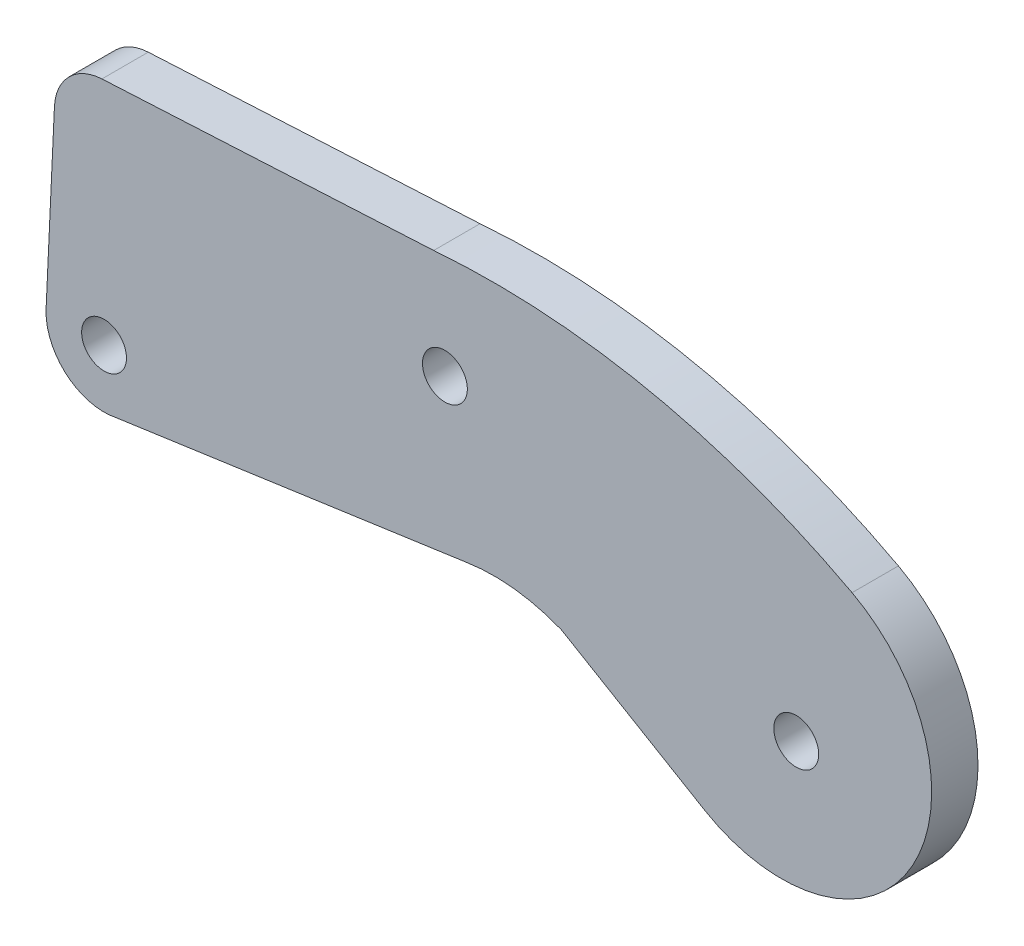
ISO-10303-21;
HEADER;
FILE_DESCRIPTION(('STEP AP214'),'2;1');
FILE_NAME('part.step','',(''),(''),'','','');
FILE_SCHEMA(('AUTOMOTIVE_DESIGN { 1 0 10303 214 1 1 1 1 }'));
ENDSEC;
DATA;
#1=APPLICATION_CONTEXT('core data for automotive mechanical design processes');
#2=APPLICATION_PROTOCOL_DEFINITION('international standard','automotive_design',2000,#1);
#3=PRODUCT_CONTEXT('',#1,'mechanical');
#4=PRODUCT('Part','Part','',(#3));
#5=PRODUCT_RELATED_PRODUCT_CATEGORY('part','',(#4));
#6=PRODUCT_DEFINITION_FORMATION('','',#4);
#7=PRODUCT_DEFINITION_CONTEXT('part definition',#1,'design');
#8=PRODUCT_DEFINITION('design','',#6,#7);
#9=PRODUCT_DEFINITION_SHAPE('','',#8);
#10=(LENGTH_UNIT() NAMED_UNIT(*) SI_UNIT(.MILLI.,.METRE.));
#11=(NAMED_UNIT(*) PLANE_ANGLE_UNIT() SI_UNIT($,.RADIAN.));
#12=(NAMED_UNIT(*) SI_UNIT($,.STERADIAN.) SOLID_ANGLE_UNIT());
#13=UNCERTAINTY_MEASURE_WITH_UNIT(LENGTH_MEASURE(1.E-05),#10,'distance_accuracy_value','');
#14=(GEOMETRIC_REPRESENTATION_CONTEXT(3) GLOBAL_UNCERTAINTY_ASSIGNED_CONTEXT((#13)) GLOBAL_UNIT_ASSIGNED_CONTEXT((#10,
#11,#12)) REPRESENTATION_CONTEXT('',''));
#15=CARTESIAN_POINT('',(0.,0.,0.));
#16=DIRECTION('',(0.,0.,1.));
#17=DIRECTION('',(1.,0.,0.));
#18=AXIS2_PLACEMENT_3D('',#15,#16,#17);
#19=CARTESIAN_POINT('',(-45.6,-19.1999999999999,6.2));
#20=DIRECTION('',(0.,0.,1.));
#21=DIRECTION('',(1.,0.,0.));
#22=AXIS2_PLACEMENT_3D('',#19,#20,#21);
#23=PLANE('',#22);
#24=CARTESIAN_POINT('',(-45.6,-19.1999999999999,6.2));
#25=DIRECTION('',(0.,0.,1.));
#26=DIRECTION('',(1.,0.,0.));
#27=AXIS2_PLACEMENT_3D('',#24,#25,#26);
#28=CIRCLE('',#27,3.);
#29=CARTESIAN_POINT('',(-48.6,-19.1999999999999,6.2));
#30=VERTEX_POINT('',#29);
#31=EDGE_CURVE('E197',#30,#30,#28,.T.);
#32=ORIENTED_EDGE('',*,*,#31,.F.);
#33=EDGE_LOOP('',(#32));
#34=FACE_BOUND('',#33,.T.);
#35=CARTESIAN_POINT('',(-45.6,-19.1999999999999,6.2));
#36=DIRECTION('',(0.,0.,1.));
#37=DIRECTION('',(1.,0.,0.));
#38=AXIS2_PLACEMENT_3D('',#35,#36,#37);
#39=CIRCLE('',#38,7.76659513557916);
#40=CARTESIAN_POINT('',(-53.3663500913287,-19.1383051143039,6.2));
#41=VERTEX_POINT('',#40);
#42=CARTESIAN_POINT('',(-44.,-26.8,6.2));
#43=VERTEX_POINT('',#42);
#44=EDGE_CURVE('E152',#41,#43,#39,.T.);
#45=ORIENTED_EDGE('',*,*,#44,.T.);
#46=DIRECTION('',(0.99001299182397,0.140976154082,0.));
#47=VECTOR('',#46,1.);
#48=CARTESIAN_POINT('',(-44.,-26.8,6.2));
#49=LINE('',#48,#47);
#50=CARTESIAN_POINT('',(2.7,-20.15,6.2));
#51=VERTEX_POINT('',#50);
#52=EDGE_CURVE('E95',#43,#51,#49,.T.);
#53=ORIENTED_EDGE('',*,*,#52,.T.);
#54=CARTESIAN_POINT('',(6.56962183960168,-43.8359879848504,6.2));
#55=DIRECTION('',(0.,0.,-1.));
#56=DIRECTION('',(1.,0.,0.));
#57=AXIS2_PLACEMENT_3D('',#54,#55,#56);
#58=CIRCLE('',#57,24.);
#59=CARTESIAN_POINT('',(15.6,-21.599705240646,6.2));
#60=VERTEX_POINT('',#59);
#61=EDGE_CURVE('E170',#51,#60,#58,.T.);
#62=ORIENTED_EDGE('',*,*,#61,.T.);
#63=DIRECTION('',(0.861052492589684,-0.508516081363305,0.));
#64=VECTOR('',#63,1.);
#65=CARTESIAN_POINT('',(15.6,-21.599705240646,6.2));
#66=LINE('',#65,#64);
#67=CARTESIAN_POINT('',(34.7684358994792,-32.9201043955809,6.2));
#68=VERTEX_POINT('',#67);
#69=EDGE_CURVE('E187',#60,#68,#66,.T.);
#70=ORIENTED_EDGE('',*,*,#69,.T.);
#71=CARTESIAN_POINT('',(45.,-15.5953548060977,6.2));
#72=DIRECTION('',(0.,0.,1.));
#73=DIRECTION('',(1.,0.,0.));
#74=AXIS2_PLACEMENT_3D('',#71,#72,#73);
#75=CIRCLE('',#74,20.1204337001309);
#76=CARTESIAN_POINT('',(54.4696096734835,2.15734484531396,6.2));
#77=VERTEX_POINT('',#76);
#78=EDGE_CURVE('E186',#68,#77,#75,.T.);
#79=ORIENTED_EDGE('',*,*,#78,.T.);
#80=CARTESIAN_POINT('',(6.55406866902199,-87.6700332005859,6.2));
#81=DIRECTION('',(0.,0.,1.));
#82=DIRECTION('',(1.,0.,0.));
#83=AXIS2_PLACEMENT_3D('',#80,#81,#82);
#84=CIRCLE('',#83,101.807941322626);
#85=CARTESIAN_POINT('',(-1.49999999999997,13.8188277360998,6.2));
#86=VERTEX_POINT('',#85);
#87=EDGE_CURVE('E117',#77,#86,#84,.T.);
#88=ORIENTED_EDGE('',*,*,#87,.T.);
#89=DIRECTION('',(-0.998638196370598,-0.0521704202559135,0.));
#90=VECTOR('',#89,1.);
#91=CARTESIAN_POINT('',(-45.8866454729241,11.5000000000001,6.2));
#92=LINE('',#91,#90);
#93=CARTESIAN_POINT('',(-45.8866454729241,11.5000000000001,6.2));
#94=VERTEX_POINT('',#93);
#95=EDGE_CURVE('E111',#86,#94,#92,.T.);
#96=ORIENTED_EDGE('',*,*,#95,.T.);
#97=CARTESIAN_POINT('',(-45.5366270007838,4.80000000000012,6.2));
#98=DIRECTION('',(0.,0.,1.));
#99=DIRECTION('',(1.,0.,0.));
#100=AXIS2_PLACEMENT_3D('',#97,#98,#99);
#101=CIRCLE('',#100,6.7091365264719);
#102=CARTESIAN_POINT('',(-52.238519213366,5.11169488569612,6.2));
#103=VERTEX_POINT('',#102);
#104=EDGE_CURVE('E115',#94,#103,#101,.T.);
#105=ORIENTED_EDGE('',*,*,#104,.T.);
#106=DIRECTION('',(-0.046458271413342,-0.998920231558699,0.));
#107=VECTOR('',#106,1.);
#108=CARTESIAN_POINT('',(-52.238519213366,5.11169488569612,6.2));
#109=LINE('',#108,#107);
#110=EDGE_CURVE('E49',#103,#41,#109,.T.);
#111=ORIENTED_EDGE('',*,*,#110,.T.);
#112=EDGE_LOOP('',(#45,#53,#62,#70,#79,#88,#96,#105,#111));
#113=FACE_BOUND('',#112,.T.);
#114=CARTESIAN_POINT('',(47.,-18.7999999999999,6.2));
#115=DIRECTION('',(0.,0.,1.));
#116=DIRECTION('',(1.,0.,0.));
#117=AXIS2_PLACEMENT_3D('',#114,#115,#116);
#118=CIRCLE('',#117,3.);
#119=CARTESIAN_POINT('',(44.,-18.7999999999999,6.2));
#120=VERTEX_POINT('',#119);
#121=EDGE_CURVE('E139',#120,#120,#118,.T.);
#122=ORIENTED_EDGE('',*,*,#121,.F.);
#123=EDGE_LOOP('',(#122));
#124=FACE_BOUND('',#123,.T.);
#125=CARTESIAN_POINT('',(0.,0.,6.2));
#126=DIRECTION('',(0.,0.,1.));
#127=DIRECTION('',(1.,0.,0.));
#128=AXIS2_PLACEMENT_3D('',#125,#126,#127);
#129=CIRCLE('',#128,3.);
#130=CARTESIAN_POINT('',(-3.,0.,6.2));
#131=VERTEX_POINT('',#130);
#132=EDGE_CURVE('E203',#131,#131,#129,.T.);
#133=ORIENTED_EDGE('',*,*,#132,.F.);
#134=EDGE_LOOP('',(#133));
#135=FACE_BOUND('',#134,.T.);
#136=ADVANCED_FACE('F32',(#34,#113,#124,#135),#23,.T.);
#137=CARTESIAN_POINT('',(-45.6,-19.1999999999999,0.));
#138=DIRECTION('',(0.,0.,1.));
#139=DIRECTION('',(1.,0.,0.));
#140=AXIS2_PLACEMENT_3D('',#137,#138,#139);
#141=PLANE('',#140);
#142=CARTESIAN_POINT('',(-45.6,-19.1999999999999,0.));
#143=DIRECTION('',(0.,0.,1.));
#144=DIRECTION('',(1.,0.,0.));
#145=AXIS2_PLACEMENT_3D('',#142,#143,#144);
#146=CIRCLE('',#145,7.76659513557916);
#147=CARTESIAN_POINT('',(-53.3663500913287,-19.1383051143039,0.));
#148=VERTEX_POINT('',#147);
#149=CARTESIAN_POINT('',(-44.,-26.8,0.));
#150=VERTEX_POINT('',#149);
#151=EDGE_CURVE('E135',#148,#150,#146,.T.);
#152=ORIENTED_EDGE('',*,*,#151,.F.);
#153=DIRECTION('',(-0.046458271413342,-0.998920231558699,0.));
#154=VECTOR('',#153,1.);
#155=CARTESIAN_POINT('',(-52.238519213366,5.11169488569612,0.));
#156=LINE('',#155,#154);
#157=CARTESIAN_POINT('',(-52.238519213366,5.11169488569612,0.));
#158=VERTEX_POINT('',#157);
#159=EDGE_CURVE('E87',#158,#148,#156,.T.);
#160=ORIENTED_EDGE('',*,*,#159,.F.);
#161=CARTESIAN_POINT('',(-45.5366270007838,4.80000000000012,0.));
#162=DIRECTION('',(0.,0.,1.));
#163=DIRECTION('',(1.,0.,0.));
#164=AXIS2_PLACEMENT_3D('',#161,#162,#163);
#165=CIRCLE('',#164,6.7091365264719);
#166=CARTESIAN_POINT('',(-45.8866454729241,11.5000000000001,0.));
#167=VERTEX_POINT('',#166);
#168=EDGE_CURVE('E81',#167,#158,#165,.T.);
#169=ORIENTED_EDGE('',*,*,#168,.F.);
#170=DIRECTION('',(-0.998638196370598,-0.0521704202559135,0.));
#171=VECTOR('',#170,1.);
#172=CARTESIAN_POINT('',(-45.8866454729241,11.5000000000001,0.));
#173=LINE('',#172,#171);
#174=CARTESIAN_POINT('',(-1.49999999999997,13.8188277360998,0.));
#175=VERTEX_POINT('',#174);
#176=EDGE_CURVE('E125',#175,#167,#173,.T.);
#177=ORIENTED_EDGE('',*,*,#176,.F.);
#178=CARTESIAN_POINT('',(6.55406866902199,-87.6700332005859,0.));
#179=DIRECTION('',(0.,0.,1.));
#180=DIRECTION('',(1.,0.,0.));
#181=AXIS2_PLACEMENT_3D('',#178,#179,#180);
#182=CIRCLE('',#181,101.807941322626);
#183=CARTESIAN_POINT('',(54.4696096734835,2.15734484531396,0.));
#184=VERTEX_POINT('',#183);
#185=EDGE_CURVE('E147',#184,#175,#182,.T.);
#186=ORIENTED_EDGE('',*,*,#185,.F.);
#187=CARTESIAN_POINT('',(45.,-15.5953548060977,0.));
#188=DIRECTION('',(0.,0.,1.));
#189=DIRECTION('',(1.,0.,0.));
#190=AXIS2_PLACEMENT_3D('',#187,#188,#189);
#191=CIRCLE('',#190,20.1204337001309);
#192=CARTESIAN_POINT('',(34.7684358994792,-32.9201043955809,0.));
#193=VERTEX_POINT('',#192);
#194=EDGE_CURVE('E145',#193,#184,#191,.T.);
#195=ORIENTED_EDGE('',*,*,#194,.F.);
#196=DIRECTION('',(0.861052492589684,-0.508516081363305,0.));
#197=VECTOR('',#196,1.);
#198=CARTESIAN_POINT('',(15.6,-21.599705240646,0.));
#199=LINE('',#198,#197);
#200=CARTESIAN_POINT('',(15.6,-21.599705240646,0.));
#201=VERTEX_POINT('',#200);
#202=EDGE_CURVE('E143',#201,#193,#199,.T.);
#203=ORIENTED_EDGE('',*,*,#202,.F.);
#204=CARTESIAN_POINT('',(6.56962183960168,-43.8359879848504,0.));
#205=DIRECTION('',(0.,0.,-1.));
#206=DIRECTION('',(1.,0.,0.));
#207=AXIS2_PLACEMENT_3D('',#204,#205,#206);
#208=CIRCLE('',#207,24.);
#209=CARTESIAN_POINT('',(2.7,-20.15,0.));
#210=VERTEX_POINT('',#209);
#211=EDGE_CURVE('E141',#210,#201,#208,.T.);
#212=ORIENTED_EDGE('',*,*,#211,.F.);
#213=DIRECTION('',(0.99001299182397,0.140976154082,0.));
#214=VECTOR('',#213,1.);
#215=CARTESIAN_POINT('',(-44.,-26.8,0.));
#216=LINE('',#215,#214);
#217=EDGE_CURVE('E138',#150,#210,#216,.T.);
#218=ORIENTED_EDGE('',*,*,#217,.F.);
#219=EDGE_LOOP('',(#152,#160,#169,#177,#186,#195,#203,#212,#218));
#220=FACE_BOUND('',#219,.T.);
#221=CARTESIAN_POINT('',(47.,-18.7999999999999,0.));
#222=DIRECTION('',(0.,0.,1.));
#223=DIRECTION('',(1.,0.,0.));
#224=AXIS2_PLACEMENT_3D('',#221,#222,#223);
#225=CIRCLE('',#224,3.);
#226=CARTESIAN_POINT('',(44.,-18.7999999999999,0.));
#227=VERTEX_POINT('',#226);
#228=EDGE_CURVE('E194',#227,#227,#225,.T.);
#229=ORIENTED_EDGE('',*,*,#228,.T.);
#230=EDGE_LOOP('',(#229));
#231=FACE_BOUND('',#230,.T.);
#232=CARTESIAN_POINT('',(-45.6,-19.1999999999999,0.));
#233=DIRECTION('',(0.,0.,1.));
#234=DIRECTION('',(1.,0.,0.));
#235=AXIS2_PLACEMENT_3D('',#232,#233,#234);
#236=CIRCLE('',#235,3.);
#237=CARTESIAN_POINT('',(-48.6,-19.1999999999999,0.));
#238=VERTEX_POINT('',#237);
#239=EDGE_CURVE('E200',#238,#238,#236,.T.);
#240=ORIENTED_EDGE('',*,*,#239,.T.);
#241=EDGE_LOOP('',(#240));
#242=FACE_BOUND('',#241,.T.);
#243=CARTESIAN_POINT('',(0.,0.,0.));
#244=DIRECTION('',(0.,0.,1.));
#245=DIRECTION('',(1.,0.,0.));
#246=AXIS2_PLACEMENT_3D('',#243,#244,#245);
#247=CIRCLE('',#246,3.);
#248=CARTESIAN_POINT('',(-3.,0.,0.));
#249=VERTEX_POINT('',#248);
#250=EDGE_CURVE('E206',#249,#249,#247,.T.);
#251=ORIENTED_EDGE('',*,*,#250,.T.);
#252=EDGE_LOOP('',(#251));
#253=FACE_BOUND('',#252,.T.);
#254=ADVANCED_FACE('F174',(#220,#231,#242,#253),#141,.F.);
#255=CARTESIAN_POINT('',(-45.6,-19.1999999999999,6.2));
#256=DIRECTION('',(0.,0.,-1.));
#257=DIRECTION('',(-1.,0.,0.));
#258=AXIS2_PLACEMENT_3D('',#255,#256,#257);
#259=CYLINDRICAL_SURFACE('',#258,7.76659513557916);
#260=ORIENTED_EDGE('',*,*,#151,.T.);
#261=DIRECTION('',(0.,0.,-1.));
#262=VECTOR('',#261,1.);
#263=CARTESIAN_POINT('',(-44.,-26.8,6.2));
#264=LINE('',#263,#262);
#265=EDGE_CURVE('E11',#43,#150,#264,.T.);
#266=ORIENTED_EDGE('',*,*,#265,.F.);
#267=ORIENTED_EDGE('',*,*,#44,.F.);
#268=DIRECTION('',(0.,0.,-1.));
#269=VECTOR('',#268,1.);
#270=CARTESIAN_POINT('',(-53.3663500913287,-19.1383051143039,6.2));
#271=LINE('',#270,#269);
#272=EDGE_CURVE('E131',#41,#148,#271,.T.);
#273=ORIENTED_EDGE('',*,*,#272,.T.);
#274=EDGE_LOOP('',(#260,#266,#267,#273));
#275=FACE_BOUND('',#274,.T.);
#276=ADVANCED_FACE('F34',(#275),#259,.T.);
#277=CARTESIAN_POINT('',(-44.,-26.8,6.2));
#278=DIRECTION('',(-0.140976154082,0.99001299182397,0.));
#279=DIRECTION('',(-0.99001299182397,-0.140976154082,0.));
#280=AXIS2_PLACEMENT_3D('',#277,#278,#279);
#281=PLANE('',#280);
#282=ORIENTED_EDGE('',*,*,#217,.T.);
#283=DIRECTION('',(0.,0.,-1.));
#284=VECTOR('',#283,1.);
#285=CARTESIAN_POINT('',(2.7,-20.15,6.2));
#286=LINE('',#285,#284);
#287=EDGE_CURVE('E41',#51,#210,#286,.T.);
#288=ORIENTED_EDGE('',*,*,#287,.F.);
#289=ORIENTED_EDGE('',*,*,#52,.F.);
#290=ORIENTED_EDGE('',*,*,#265,.T.);
#291=EDGE_LOOP('',(#282,#288,#289,#290));
#292=FACE_BOUND('',#291,.T.);
#293=ADVANCED_FACE('F243',(#292),#281,.F.);
#294=CARTESIAN_POINT('',(6.56962183960168,-43.8359879848504,6.2));
#295=DIRECTION('',(0.,0.,-1.));
#296=DIRECTION('',(-1.,0.,0.));
#297=AXIS2_PLACEMENT_3D('',#294,#295,#296);
#298=CYLINDRICAL_SURFACE('',#297,24.);
#299=ORIENTED_EDGE('',*,*,#211,.T.);
#300=DIRECTION('',(0.,0.,-1.));
#301=VECTOR('',#300,1.);
#302=CARTESIAN_POINT('',(15.6,-21.599705240646,6.2));
#303=LINE('',#302,#301);
#304=EDGE_CURVE('E162',#60,#201,#303,.T.);
#305=ORIENTED_EDGE('',*,*,#304,.F.);
#306=ORIENTED_EDGE('',*,*,#61,.F.);
#307=ORIENTED_EDGE('',*,*,#287,.T.);
#308=EDGE_LOOP('',(#299,#305,#306,#307));
#309=FACE_BOUND('',#308,.T.);
#310=ADVANCED_FACE('F168',(#309),#298,.F.);
#311=CARTESIAN_POINT('',(15.6,-21.599705240646,6.2));
#312=DIRECTION('',(0.508516081363305,0.861052492589684,0.));
#313=DIRECTION('',(-0.861052492589684,0.508516081363305,0.));
#314=AXIS2_PLACEMENT_3D('',#311,#312,#313);
#315=PLANE('',#314);
#316=ORIENTED_EDGE('',*,*,#202,.T.);
#317=DIRECTION('',(0.,0.,-1.));
#318=VECTOR('',#317,1.);
#319=CARTESIAN_POINT('',(34.7684358994792,-32.9201043955809,6.2));
#320=LINE('',#319,#318);
#321=EDGE_CURVE('E159',#68,#193,#320,.T.);
#322=ORIENTED_EDGE('',*,*,#321,.F.);
#323=ORIENTED_EDGE('',*,*,#69,.F.);
#324=ORIENTED_EDGE('',*,*,#304,.T.);
#325=EDGE_LOOP('',(#316,#322,#323,#324));
#326=FACE_BOUND('',#325,.T.);
#327=ADVANCED_FACE('F180',(#326),#315,.F.);
#328=CARTESIAN_POINT('',(45.,-15.5953548060977,6.2));
#329=DIRECTION('',(0.,0.,-1.));
#330=DIRECTION('',(-1.,0.,0.));
#331=AXIS2_PLACEMENT_3D('',#328,#329,#330);
#332=CYLINDRICAL_SURFACE('',#331,20.1204337001309);
#333=ORIENTED_EDGE('',*,*,#194,.T.);
#334=DIRECTION('',(0.,0.,-1.));
#335=VECTOR('',#334,1.);
#336=CARTESIAN_POINT('',(54.4696096734835,2.15734484531396,6.2));
#337=LINE('',#336,#335);
#338=EDGE_CURVE('E156',#77,#184,#337,.T.);
#339=ORIENTED_EDGE('',*,*,#338,.F.);
#340=ORIENTED_EDGE('',*,*,#78,.F.);
#341=ORIENTED_EDGE('',*,*,#321,.T.);
#342=EDGE_LOOP('',(#333,#339,#340,#341));
#343=FACE_BOUND('',#342,.T.);
#344=ADVANCED_FACE('F184',(#343),#332,.T.);
#345=CARTESIAN_POINT('',(6.55406866902199,-87.6700332005859,6.2));
#346=DIRECTION('',(0.,0.,-1.));
#347=DIRECTION('',(-1.,0.,0.));
#348=AXIS2_PLACEMENT_3D('',#345,#346,#347);
#349=CYLINDRICAL_SURFACE('',#348,101.807941322626);
#350=ORIENTED_EDGE('',*,*,#185,.T.);
#351=DIRECTION('',(0.,0.,-1.));
#352=VECTOR('',#351,1.);
#353=CARTESIAN_POINT('',(-1.49999999999997,13.8188277360998,6.2));
#354=LINE('',#353,#352);
#355=EDGE_CURVE('E126',#86,#175,#354,.T.);
#356=ORIENTED_EDGE('',*,*,#355,.F.);
#357=ORIENTED_EDGE('',*,*,#87,.F.);
#358=ORIENTED_EDGE('',*,*,#338,.T.);
#359=EDGE_LOOP('',(#350,#356,#357,#358));
#360=FACE_BOUND('',#359,.T.);
#361=ADVANCED_FACE('F234',(#360),#349,.T.);
#362=CARTESIAN_POINT('',(-45.8866454729241,11.5000000000001,6.2));
#363=DIRECTION('',(0.0521704202559135,-0.998638196370598,0.));
#364=DIRECTION('',(0.998638196370598,0.0521704202559135,0.));
#365=AXIS2_PLACEMENT_3D('',#362,#363,#364);
#366=PLANE('',#365);
#367=ORIENTED_EDGE('',*,*,#176,.T.);
#368=DIRECTION('',(0.,0.,-1.));
#369=VECTOR('',#368,1.);
#370=CARTESIAN_POINT('',(-45.8866454729241,11.5000000000001,6.2));
#371=LINE('',#370,#369);
#372=EDGE_CURVE('E122',#94,#167,#371,.T.);
#373=ORIENTED_EDGE('',*,*,#372,.F.);
#374=ORIENTED_EDGE('',*,*,#95,.F.);
#375=ORIENTED_EDGE('',*,*,#355,.T.);
#376=EDGE_LOOP('',(#367,#373,#374,#375));
#377=FACE_BOUND('',#376,.T.);
#378=ADVANCED_FACE('F123',(#377),#366,.F.);
#379=CARTESIAN_POINT('',(-45.5366270007838,4.80000000000012,6.2));
#380=DIRECTION('',(0.,0.,-1.));
#381=DIRECTION('',(-1.,0.,0.));
#382=AXIS2_PLACEMENT_3D('',#379,#380,#381);
#383=CYLINDRICAL_SURFACE('',#382,6.7091365264719);
#384=ORIENTED_EDGE('',*,*,#168,.T.);
#385=DIRECTION('',(0.,0.,-1.));
#386=VECTOR('',#385,1.);
#387=CARTESIAN_POINT('',(-52.238519213366,5.11169488569612,6.2));
#388=LINE('',#387,#386);
#389=EDGE_CURVE('E127',#103,#158,#388,.T.);
#390=ORIENTED_EDGE('',*,*,#389,.F.);
#391=ORIENTED_EDGE('',*,*,#104,.F.);
#392=ORIENTED_EDGE('',*,*,#372,.T.);
#393=EDGE_LOOP('',(#384,#390,#391,#392));
#394=FACE_BOUND('',#393,.T.);
#395=ADVANCED_FACE('F129',(#394),#383,.T.);
#396=CARTESIAN_POINT('',(-52.238519213366,5.11169488569612,6.2));
#397=DIRECTION('',(0.998920231558699,-0.046458271413342,0.));
#398=DIRECTION('',(0.046458271413342,0.998920231558699,0.));
#399=AXIS2_PLACEMENT_3D('',#396,#397,#398);
#400=PLANE('',#399);
#401=ORIENTED_EDGE('',*,*,#159,.T.);
#402=ORIENTED_EDGE('',*,*,#272,.F.);
#403=ORIENTED_EDGE('',*,*,#110,.F.);
#404=ORIENTED_EDGE('',*,*,#389,.T.);
#405=EDGE_LOOP('',(#401,#402,#403,#404));
#406=FACE_BOUND('',#405,.T.);
#407=ADVANCED_FACE('F227',(#406),#400,.F.);
#408=CARTESIAN_POINT('',(47.,-18.7999999999999,6.2));
#409=DIRECTION('',(0.,0.,-1.));
#410=DIRECTION('',(-1.,0.,0.));
#411=AXIS2_PLACEMENT_3D('',#408,#409,#410);
#412=CYLINDRICAL_SURFACE('',#411,3.);
#413=CARTESIAN_POINT('',(44.,-18.7999999999999,6.2));
#414=CARTESIAN_POINT('',(44.,-18.7999999999999,6.13541666666667));
#415=CARTESIAN_POINT('',(44.,-18.7999999999999,6.07083333333333));
#416=CARTESIAN_POINT('',(44.,-18.7999999999999,5.94166666666667));
#417=CARTESIAN_POINT('',(44.,-18.7999999999999,5.87708333333333));
#418=CARTESIAN_POINT('',(44.,-18.7999999999999,5.74791666666667));
#419=CARTESIAN_POINT('',(44.,-18.7999999999999,5.68333333333333));
#420=CARTESIAN_POINT('',(44.,-18.7999999999999,5.55416666666667));
#421=CARTESIAN_POINT('',(44.,-18.7999999999999,5.48958333333333));
#422=CARTESIAN_POINT('',(44.,-18.7999999999999,5.36041666666667));
#423=CARTESIAN_POINT('',(44.,-18.7999999999999,5.29583333333333));
#424=CARTESIAN_POINT('',(44.,-18.7999999999999,5.16666666666667));
#425=CARTESIAN_POINT('',(44.,-18.7999999999999,5.10208333333333));
#426=CARTESIAN_POINT('',(44.,-18.7999999999999,4.97291666666667));
#427=CARTESIAN_POINT('',(44.,-18.7999999999999,4.90833333333333));
#428=CARTESIAN_POINT('',(44.,-18.7999999999999,4.77916666666667));
#429=CARTESIAN_POINT('',(44.,-18.7999999999999,4.71458333333333));
#430=CARTESIAN_POINT('',(44.,-18.7999999999999,4.58541666666667));
#431=CARTESIAN_POINT('',(44.,-18.7999999999999,4.52083333333333));
#432=CARTESIAN_POINT('',(44.,-18.7999999999999,4.39166666666667));
#433=CARTESIAN_POINT('',(44.,-18.7999999999999,4.32708333333333));
#434=CARTESIAN_POINT('',(44.,-18.7999999999999,4.19791666666667));
#435=CARTESIAN_POINT('',(44.,-18.7999999999999,4.13333333333333));
#436=CARTESIAN_POINT('',(44.,-18.7999999999999,4.00416666666667));
#437=CARTESIAN_POINT('',(44.,-18.7999999999999,3.93958333333333));
#438=CARTESIAN_POINT('',(44.,-18.7999999999999,3.81041666666667));
#439=CARTESIAN_POINT('',(44.,-18.7999999999999,3.74583333333333));
#440=CARTESIAN_POINT('',(44.,-18.7999999999999,3.61666666666667));
#441=CARTESIAN_POINT('',(44.,-18.7999999999999,3.55208333333333));
#442=CARTESIAN_POINT('',(44.,-18.7999999999999,3.42291666666667));
#443=CARTESIAN_POINT('',(44.,-18.7999999999999,3.35833333333333));
#444=CARTESIAN_POINT('',(44.,-18.7999999999999,3.22916666666667));
#445=CARTESIAN_POINT('',(44.,-18.7999999999999,3.16458333333333));
#446=CARTESIAN_POINT('',(44.,-18.7999999999999,3.03541666666667));
#447=CARTESIAN_POINT('',(44.,-18.7999999999999,2.97083333333333));
#448=CARTESIAN_POINT('',(44.,-18.7999999999999,2.84166666666667));
#449=CARTESIAN_POINT('',(44.,-18.7999999999999,2.77708333333333));
#450=CARTESIAN_POINT('',(44.,-18.7999999999999,2.64791666666667));
#451=CARTESIAN_POINT('',(44.,-18.7999999999999,2.58333333333333));
#452=CARTESIAN_POINT('',(44.,-18.7999999999999,2.45416666666667));
#453=CARTESIAN_POINT('',(44.,-18.7999999999999,2.38958333333333));
#454=CARTESIAN_POINT('',(44.,-18.7999999999999,2.26041666666667));
#455=CARTESIAN_POINT('',(44.,-18.7999999999999,2.19583333333333));
#456=CARTESIAN_POINT('',(44.,-18.7999999999999,2.06666666666667));
#457=CARTESIAN_POINT('',(44.,-18.7999999999999,2.00208333333333));
#458=CARTESIAN_POINT('',(44.,-18.7999999999999,1.87291666666667));
#459=CARTESIAN_POINT('',(44.,-18.7999999999999,1.80833333333333));
#460=CARTESIAN_POINT('',(44.,-18.7999999999999,1.67916666666667));
#461=CARTESIAN_POINT('',(44.,-18.7999999999999,1.61458333333333));
#462=CARTESIAN_POINT('',(44.,-18.7999999999999,1.48541666666667));
#463=CARTESIAN_POINT('',(44.,-18.7999999999999,1.42083333333333));
#464=CARTESIAN_POINT('',(44.,-18.7999999999999,1.29166666666667));
#465=CARTESIAN_POINT('',(44.,-18.7999999999999,1.22708333333333));
#466=CARTESIAN_POINT('',(44.,-18.7999999999999,1.09791666666667));
#467=CARTESIAN_POINT('',(44.,-18.7999999999999,1.03333333333333));
#468=CARTESIAN_POINT('',(44.,-18.7999999999999,0.904166666666667));
#469=CARTESIAN_POINT('',(44.,-18.7999999999999,0.839583333333333));
#470=CARTESIAN_POINT('',(44.,-18.7999999999999,0.710416666666666));
#471=CARTESIAN_POINT('',(44.,-18.7999999999999,0.645833333333333));
#472=CARTESIAN_POINT('',(44.,-18.7999999999999,0.516666666666667));
#473=CARTESIAN_POINT('',(44.,-18.7999999999999,0.452083333333333));
#474=CARTESIAN_POINT('',(44.,-18.7999999999999,0.322916666666667));
#475=CARTESIAN_POINT('',(44.,-18.7999999999999,0.258333333333334));
#476=CARTESIAN_POINT('',(44.,-18.7999999999999,0.129166666666667));
#477=CARTESIAN_POINT('',(44.,-18.7999999999999,0.0645833333333335));
#478=CARTESIAN_POINT('',(44.,-18.7999999999999,0.));
#479=B_SPLINE_CURVE_WITH_KNOTS('',3,(#413,#414,#415,#416,#417,#418,#419,#420,#421,#422,#423,
#424,#425,#426,#427,#428,#429,#430,#431,#432,#433,#434,#435,#436,#437,#438,#439,#440,#441,#442,
#443,#444,#445,#446,#447,#448,#449,#450,#451,#452,#453,#454,#455,#456,#457,#458,#459,#460,#461,
#462,#463,#464,#465,#466,#467,#468,#469,#470,#471,#472,#473,#474,#475,#476,#477,#478),
.UNSPECIFIED.,.F.,.F.,(4,2,2,2,2,2,2,2,2,2,2,2,2,2,2,2,2,2,2,2,2,2,2,2,2,2,2,2,2,2,2,2,4),(0.,
0.193749999999999,0.3875,0.581249999999999,0.775,0.968749999999999,1.1625,1.35625,1.55,1.74375,
1.9375,2.13125,2.325,2.51875,2.7125,2.90625,3.1,3.29375,3.4875,3.68125,3.875,4.06875,4.2625,
4.45625,4.65,4.84375,5.0375,5.23125,5.425,5.61875,5.8125,6.00625,6.2),.UNSPECIFIED.);
#480=EDGE_CURVE('BSEAM224',#120,#227,#479,.T.);
#481=ORIENTED_EDGE('',*,*,#121,.T.);
#482=ORIENTED_EDGE('',*,*,#228,.F.);
#483=ORIENTED_EDGE('',*,*,#480,.T.);
#484=ORIENTED_EDGE('',*,*,#480,.F.);
#485=EDGE_LOOP('',(#481,#483,#482,#484));
#486=FACE_BOUND('',#485,.T.);
#487=ADVANCED_FACE('F224',(#486),#412,.F.);
#488=CARTESIAN_POINT('',(-45.6,-19.1999999999999,6.2));
#489=DIRECTION('',(0.,0.,-1.));
#490=DIRECTION('',(-1.,0.,0.));
#491=AXIS2_PLACEMENT_3D('',#488,#489,#490);
#492=CYLINDRICAL_SURFACE('',#491,3.);
#493=CARTESIAN_POINT('',(-48.6,-19.1999999999999,6.2));
#494=CARTESIAN_POINT('',(-48.6,-19.1999999999999,6.13541666666667));
#495=CARTESIAN_POINT('',(-48.6,-19.1999999999999,6.07083333333333));
#496=CARTESIAN_POINT('',(-48.6,-19.1999999999999,5.94166666666667));
#497=CARTESIAN_POINT('',(-48.6,-19.1999999999999,5.87708333333333));
#498=CARTESIAN_POINT('',(-48.6,-19.1999999999999,5.74791666666667));
#499=CARTESIAN_POINT('',(-48.6,-19.1999999999999,5.68333333333333));
#500=CARTESIAN_POINT('',(-48.6,-19.1999999999999,5.55416666666667));
#501=CARTESIAN_POINT('',(-48.6,-19.1999999999999,5.48958333333333));
#502=CARTESIAN_POINT('',(-48.6,-19.1999999999999,5.36041666666667));
#503=CARTESIAN_POINT('',(-48.6,-19.1999999999999,5.29583333333333));
#504=CARTESIAN_POINT('',(-48.6,-19.1999999999999,5.16666666666667));
#505=CARTESIAN_POINT('',(-48.6,-19.1999999999999,5.10208333333333));
#506=CARTESIAN_POINT('',(-48.6,-19.1999999999999,4.97291666666667));
#507=CARTESIAN_POINT('',(-48.6,-19.1999999999999,4.90833333333333));
#508=CARTESIAN_POINT('',(-48.6,-19.1999999999999,4.77916666666667));
#509=CARTESIAN_POINT('',(-48.6,-19.1999999999999,4.71458333333333));
#510=CARTESIAN_POINT('',(-48.6,-19.1999999999999,4.58541666666667));
#511=CARTESIAN_POINT('',(-48.6,-19.1999999999999,4.52083333333333));
#512=CARTESIAN_POINT('',(-48.6,-19.1999999999999,4.39166666666667));
#513=CARTESIAN_POINT('',(-48.6,-19.1999999999999,4.32708333333333));
#514=CARTESIAN_POINT('',(-48.6,-19.1999999999999,4.19791666666667));
#515=CARTESIAN_POINT('',(-48.6,-19.1999999999999,4.13333333333333));
#516=CARTESIAN_POINT('',(-48.6,-19.1999999999999,4.00416666666667));
#517=CARTESIAN_POINT('',(-48.6,-19.1999999999999,3.93958333333333));
#518=CARTESIAN_POINT('',(-48.6,-19.1999999999999,3.81041666666667));
#519=CARTESIAN_POINT('',(-48.6,-19.1999999999999,3.74583333333333));
#520=CARTESIAN_POINT('',(-48.6,-19.1999999999999,3.61666666666667));
#521=CARTESIAN_POINT('',(-48.6,-19.1999999999999,3.55208333333333));
#522=CARTESIAN_POINT('',(-48.6,-19.1999999999999,3.42291666666667));
#523=CARTESIAN_POINT('',(-48.6,-19.1999999999999,3.35833333333333));
#524=CARTESIAN_POINT('',(-48.6,-19.1999999999999,3.22916666666667));
#525=CARTESIAN_POINT('',(-48.6,-19.1999999999999,3.16458333333333));
#526=CARTESIAN_POINT('',(-48.6,-19.1999999999999,3.03541666666667));
#527=CARTESIAN_POINT('',(-48.6,-19.1999999999999,2.97083333333333));
#528=CARTESIAN_POINT('',(-48.6,-19.1999999999999,2.84166666666667));
#529=CARTESIAN_POINT('',(-48.6,-19.1999999999999,2.77708333333333));
#530=CARTESIAN_POINT('',(-48.6,-19.1999999999999,2.64791666666667));
#531=CARTESIAN_POINT('',(-48.6,-19.1999999999999,2.58333333333333));
#532=CARTESIAN_POINT('',(-48.6,-19.1999999999999,2.45416666666667));
#533=CARTESIAN_POINT('',(-48.6,-19.1999999999999,2.38958333333333));
#534=CARTESIAN_POINT('',(-48.6,-19.1999999999999,2.26041666666667));
#535=CARTESIAN_POINT('',(-48.6,-19.1999999999999,2.19583333333333));
#536=CARTESIAN_POINT('',(-48.6,-19.1999999999999,2.06666666666667));
#537=CARTESIAN_POINT('',(-48.6,-19.1999999999999,2.00208333333333));
#538=CARTESIAN_POINT('',(-48.6,-19.1999999999999,1.87291666666667));
#539=CARTESIAN_POINT('',(-48.6,-19.1999999999999,1.80833333333333));
#540=CARTESIAN_POINT('',(-48.6,-19.1999999999999,1.67916666666667));
#541=CARTESIAN_POINT('',(-48.6,-19.1999999999999,1.61458333333333));
#542=CARTESIAN_POINT('',(-48.6,-19.1999999999999,1.48541666666667));
#543=CARTESIAN_POINT('',(-48.6,-19.1999999999999,1.42083333333333));
#544=CARTESIAN_POINT('',(-48.6,-19.1999999999999,1.29166666666667));
#545=CARTESIAN_POINT('',(-48.6,-19.1999999999999,1.22708333333333));
#546=CARTESIAN_POINT('',(-48.6,-19.1999999999999,1.09791666666667));
#547=CARTESIAN_POINT('',(-48.6,-19.1999999999999,1.03333333333333));
#548=CARTESIAN_POINT('',(-48.6,-19.1999999999999,0.904166666666667));
#549=CARTESIAN_POINT('',(-48.6,-19.1999999999999,0.839583333333333));
#550=CARTESIAN_POINT('',(-48.6,-19.1999999999999,0.710416666666666));
#551=CARTESIAN_POINT('',(-48.6,-19.1999999999999,0.645833333333333));
#552=CARTESIAN_POINT('',(-48.6,-19.1999999999999,0.516666666666667));
#553=CARTESIAN_POINT('',(-48.6,-19.1999999999999,0.452083333333333));
#554=CARTESIAN_POINT('',(-48.6,-19.1999999999999,0.322916666666667));
#555=CARTESIAN_POINT('',(-48.6,-19.1999999999999,0.258333333333334));
#556=CARTESIAN_POINT('',(-48.6,-19.1999999999999,0.129166666666667));
#557=CARTESIAN_POINT('',(-48.6,-19.1999999999999,0.0645833333333335));
#558=CARTESIAN_POINT('',(-48.6,-19.1999999999999,0.));
#559=B_SPLINE_CURVE_WITH_KNOTS('',3,(#493,#494,#495,#496,#497,#498,#499,#500,#501,#502,#503,
#504,#505,#506,#507,#508,#509,#510,#511,#512,#513,#514,#515,#516,#517,#518,#519,#520,#521,#522,
#523,#524,#525,#526,#527,#528,#529,#530,#531,#532,#533,#534,#535,#536,#537,#538,#539,#540,#541,
#542,#543,#544,#545,#546,#547,#548,#549,#550,#551,#552,#553,#554,#555,#556,#557,#558),
.UNSPECIFIED.,.F.,.F.,(4,2,2,2,2,2,2,2,2,2,2,2,2,2,2,2,2,2,2,2,2,2,2,2,2,2,2,2,2,2,2,2,4),(0.,
0.193749999999999,0.3875,0.581249999999999,0.775,0.968749999999999,1.1625,1.35625,1.55,1.74375,
1.9375,2.13125,2.325,2.51875,2.7125,2.90625,3.1,3.29375,3.4875,3.68125,3.875,4.06875,4.2625,
4.45625,4.65,4.84375,5.0375,5.23125,5.425,5.61875,5.8125,6.00625,6.2),.UNSPECIFIED.);
#560=EDGE_CURVE('BSEAM312',#30,#238,#559,.T.);
#561=ORIENTED_EDGE('',*,*,#31,.T.);
#562=ORIENTED_EDGE('',*,*,#239,.F.);
#563=ORIENTED_EDGE('',*,*,#560,.T.);
#564=ORIENTED_EDGE('',*,*,#560,.F.);
#565=EDGE_LOOP('',(#561,#563,#562,#564));
#566=FACE_BOUND('',#565,.T.);
#567=ADVANCED_FACE('F312',(#566),#492,.F.);
#568=CARTESIAN_POINT('',(0.,0.,6.2));
#569=DIRECTION('',(0.,0.,-1.));
#570=DIRECTION('',(-1.,0.,0.));
#571=AXIS2_PLACEMENT_3D('',#568,#569,#570);
#572=CYLINDRICAL_SURFACE('',#571,3.);
#573=CARTESIAN_POINT('',(-3.,0.,6.2));
#574=CARTESIAN_POINT('',(-3.,0.,6.13541666666667));
#575=CARTESIAN_POINT('',(-3.,0.,6.07083333333333));
#576=CARTESIAN_POINT('',(-3.,0.,5.94166666666667));
#577=CARTESIAN_POINT('',(-3.,0.,5.87708333333333));
#578=CARTESIAN_POINT('',(-3.,0.,5.74791666666667));
#579=CARTESIAN_POINT('',(-3.,0.,5.68333333333333));
#580=CARTESIAN_POINT('',(-3.,0.,5.55416666666667));
#581=CARTESIAN_POINT('',(-3.,0.,5.48958333333333));
#582=CARTESIAN_POINT('',(-3.,0.,5.36041666666667));
#583=CARTESIAN_POINT('',(-3.,0.,5.29583333333333));
#584=CARTESIAN_POINT('',(-3.,0.,5.16666666666667));
#585=CARTESIAN_POINT('',(-3.,0.,5.10208333333333));
#586=CARTESIAN_POINT('',(-3.,0.,4.97291666666667));
#587=CARTESIAN_POINT('',(-3.,0.,4.90833333333333));
#588=CARTESIAN_POINT('',(-3.,0.,4.77916666666667));
#589=CARTESIAN_POINT('',(-3.,0.,4.71458333333333));
#590=CARTESIAN_POINT('',(-3.,0.,4.58541666666667));
#591=CARTESIAN_POINT('',(-3.,0.,4.52083333333333));
#592=CARTESIAN_POINT('',(-3.,0.,4.39166666666667));
#593=CARTESIAN_POINT('',(-3.,0.,4.32708333333333));
#594=CARTESIAN_POINT('',(-3.,0.,4.19791666666667));
#595=CARTESIAN_POINT('',(-3.,0.,4.13333333333333));
#596=CARTESIAN_POINT('',(-3.,0.,4.00416666666667));
#597=CARTESIAN_POINT('',(-3.,0.,3.93958333333333));
#598=CARTESIAN_POINT('',(-3.,0.,3.81041666666667));
#599=CARTESIAN_POINT('',(-3.,0.,3.74583333333333));
#600=CARTESIAN_POINT('',(-3.,0.,3.61666666666667));
#601=CARTESIAN_POINT('',(-3.,0.,3.55208333333333));
#602=CARTESIAN_POINT('',(-3.,0.,3.42291666666667));
#603=CARTESIAN_POINT('',(-3.,0.,3.35833333333333));
#604=CARTESIAN_POINT('',(-3.,0.,3.22916666666667));
#605=CARTESIAN_POINT('',(-3.,0.,3.16458333333333));
#606=CARTESIAN_POINT('',(-3.,0.,3.03541666666667));
#607=CARTESIAN_POINT('',(-3.,0.,2.97083333333333));
#608=CARTESIAN_POINT('',(-3.,0.,2.84166666666667));
#609=CARTESIAN_POINT('',(-3.,0.,2.77708333333333));
#610=CARTESIAN_POINT('',(-3.,0.,2.64791666666667));
#611=CARTESIAN_POINT('',(-3.,0.,2.58333333333333));
#612=CARTESIAN_POINT('',(-3.,0.,2.45416666666667));
#613=CARTESIAN_POINT('',(-3.,0.,2.38958333333333));
#614=CARTESIAN_POINT('',(-3.,0.,2.26041666666667));
#615=CARTESIAN_POINT('',(-3.,0.,2.19583333333333));
#616=CARTESIAN_POINT('',(-3.,0.,2.06666666666667));
#617=CARTESIAN_POINT('',(-3.,0.,2.00208333333333));
#618=CARTESIAN_POINT('',(-3.,0.,1.87291666666667));
#619=CARTESIAN_POINT('',(-3.,0.,1.80833333333333));
#620=CARTESIAN_POINT('',(-3.,0.,1.67916666666667));
#621=CARTESIAN_POINT('',(-3.,0.,1.61458333333333));
#622=CARTESIAN_POINT('',(-3.,0.,1.48541666666667));
#623=CARTESIAN_POINT('',(-3.,0.,1.42083333333333));
#624=CARTESIAN_POINT('',(-3.,0.,1.29166666666667));
#625=CARTESIAN_POINT('',(-3.,0.,1.22708333333333));
#626=CARTESIAN_POINT('',(-3.,0.,1.09791666666667));
#627=CARTESIAN_POINT('',(-3.,0.,1.03333333333333));
#628=CARTESIAN_POINT('',(-3.,0.,0.904166666666667));
#629=CARTESIAN_POINT('',(-3.,0.,0.839583333333333));
#630=CARTESIAN_POINT('',(-3.,0.,0.710416666666666));
#631=CARTESIAN_POINT('',(-3.,0.,0.645833333333333));
#632=CARTESIAN_POINT('',(-3.,0.,0.516666666666667));
#633=CARTESIAN_POINT('',(-3.,0.,0.452083333333333));
#634=CARTESIAN_POINT('',(-3.,0.,0.322916666666667));
#635=CARTESIAN_POINT('',(-3.,0.,0.258333333333334));
#636=CARTESIAN_POINT('',(-3.,0.,0.129166666666667));
#637=CARTESIAN_POINT('',(-3.,0.,0.0645833333333335));
#638=CARTESIAN_POINT('',(-3.,0.,0.));
#639=B_SPLINE_CURVE_WITH_KNOTS('',3,(#573,#574,#575,#576,#577,#578,#579,#580,#581,#582,#583,
#584,#585,#586,#587,#588,#589,#590,#591,#592,#593,#594,#595,#596,#597,#598,#599,#600,#601,#602,
#603,#604,#605,#606,#607,#608,#609,#610,#611,#612,#613,#614,#615,#616,#617,#618,#619,#620,#621,
#622,#623,#624,#625,#626,#627,#628,#629,#630,#631,#632,#633,#634,#635,#636,#637,#638),
.UNSPECIFIED.,.F.,.F.,(4,2,2,2,2,2,2,2,2,2,2,2,2,2,2,2,2,2,2,2,2,2,2,2,2,2,2,2,2,2,2,2,4),(0.,
0.193749999999999,0.3875,0.581249999999999,0.775,0.968749999999999,1.1625,1.35625,1.55,1.74375,
1.9375,2.13125,2.325,2.51875,2.7125,2.90625,3.1,3.29375,3.4875,3.68125,3.875,4.06875,4.2625,
4.45625,4.65,4.84375,5.0375,5.23125,5.425,5.61875,5.8125,6.00625,6.2),.UNSPECIFIED.);
#640=EDGE_CURVE('BSEAM212',#131,#249,#639,.T.);
#641=ORIENTED_EDGE('',*,*,#132,.T.);
#642=ORIENTED_EDGE('',*,*,#250,.F.);
#643=ORIENTED_EDGE('',*,*,#640,.T.);
#644=ORIENTED_EDGE('',*,*,#640,.F.);
#645=EDGE_LOOP('',(#641,#643,#642,#644));
#646=FACE_BOUND('',#645,.T.);
#647=ADVANCED_FACE('F212',(#646),#572,.F.);
#648=CLOSED_SHELL('',(#136,#254,#276,#293,#310,#327,#344,#361,#378,#395,#407,#487,#567,#647));
#649=MANIFOLD_SOLID_BREP('B2',#648);
#650=ADVANCED_BREP_SHAPE_REPRESENTATION('',(#18,#649),#14);
#651=SHAPE_DEFINITION_REPRESENTATION(#9,#650);
ENDSEC;
END-ISO-10303-21;
